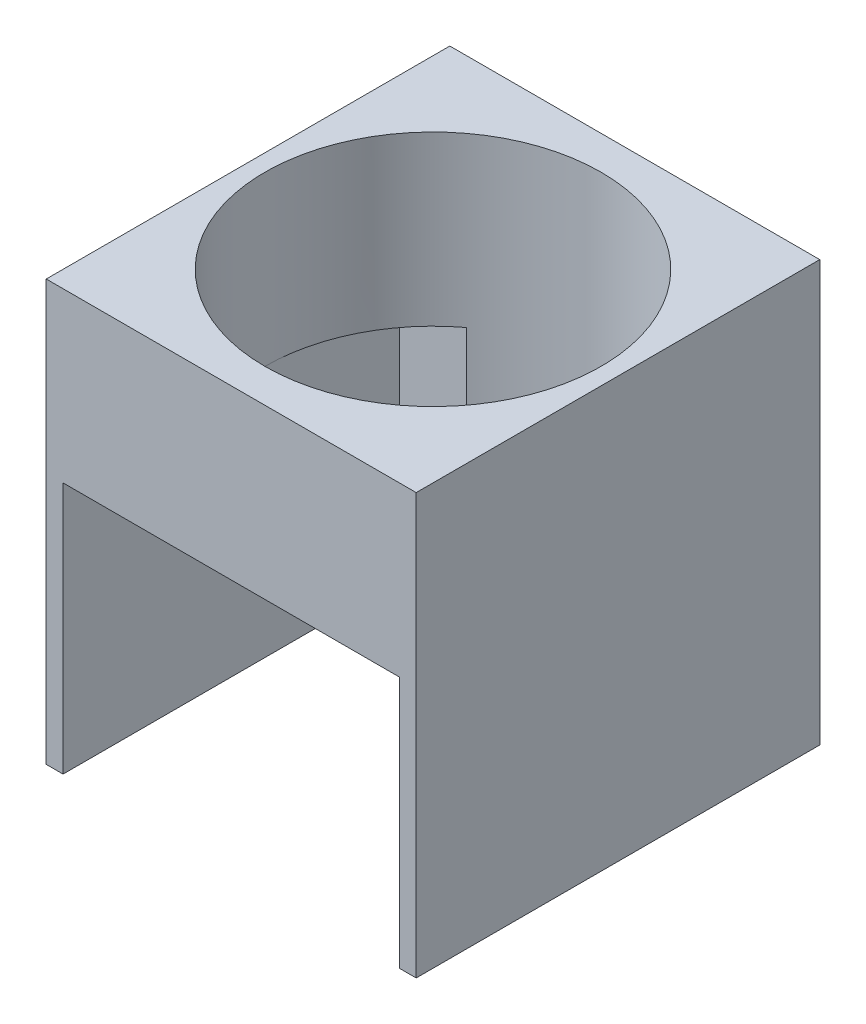
ISO-10303-21;
HEADER;
FILE_DESCRIPTION(('STEP AP214'),'2;1');
FILE_NAME('part.step','',(''),(''),'','','');
FILE_SCHEMA(('AUTOMOTIVE_DESIGN { 1 0 10303 214 1 1 1 1 }'));
ENDSEC;
DATA;
#1=APPLICATION_CONTEXT('core data for automotive mechanical design processes');
#2=APPLICATION_PROTOCOL_DEFINITION('international standard','automotive_design',2000,#1);
#3=PRODUCT_CONTEXT('',#1,'mechanical');
#4=PRODUCT('Part','Part','',(#3));
#5=PRODUCT_RELATED_PRODUCT_CATEGORY('part','',(#4));
#6=PRODUCT_DEFINITION_FORMATION('','',#4);
#7=PRODUCT_DEFINITION_CONTEXT('part definition',#1,'design');
#8=PRODUCT_DEFINITION('design','',#6,#7);
#9=PRODUCT_DEFINITION_SHAPE('','',#8);
#10=(LENGTH_UNIT() NAMED_UNIT(*) SI_UNIT(.MILLI.,.METRE.));
#11=(NAMED_UNIT(*) PLANE_ANGLE_UNIT() SI_UNIT($,.RADIAN.));
#12=(NAMED_UNIT(*) SI_UNIT($,.STERADIAN.) SOLID_ANGLE_UNIT());
#13=UNCERTAINTY_MEASURE_WITH_UNIT(LENGTH_MEASURE(1.E-05),#10,'distance_accuracy_value','');
#14=(GEOMETRIC_REPRESENTATION_CONTEXT(3) GLOBAL_UNCERTAINTY_ASSIGNED_CONTEXT((#13)) GLOBAL_UNIT_ASSIGNED_CONTEXT((#10,
#11,#12)) REPRESENTATION_CONTEXT('',''));
#15=CARTESIAN_POINT('',(0.,0.,0.));
#16=DIRECTION('',(0.,0.,1.));
#17=DIRECTION('',(1.,0.,0.));
#18=AXIS2_PLACEMENT_3D('',#15,#16,#17);
#19=CARTESIAN_POINT('',(0.,530.,0.));
#20=DIRECTION('',(0.,0.,-1.));
#21=DIRECTION('',(-1.,0.,0.));
#22=AXIS2_PLACEMENT_3D('',#19,#20,#21);
#23=PLANE('',#22);
#24=DIRECTION('',(0.,-1.,0.));
#25=VECTOR('',#24,1.);
#26=CARTESIAN_POINT('',(445.,530.,0.));
#27=LINE('',#26,#25);
#28=CARTESIAN_POINT('',(445.,530.,0.));
#29=VERTEX_POINT('',#28);
#30=CARTESIAN_POINT('',(445.,405.,0.));
#31=VERTEX_POINT('',#30);
#32=EDGE_CURVE('E156',#29,#31,#27,.T.);
#33=ORIENTED_EDGE('',*,*,#32,.T.);
#34=DIRECTION('',(1.,0.,0.));
#35=VECTOR('',#34,1.);
#36=CARTESIAN_POINT('',(0.,405.,0.));
#37=LINE('',#36,#35);
#38=CARTESIAN_POINT('',(450.,405.,0.));
#39=VERTEX_POINT('',#38);
#40=EDGE_CURVE('E122',#31,#39,#37,.T.);
#41=ORIENTED_EDGE('',*,*,#40,.T.);
#42=DIRECTION('',(0.,-1.,0.));
#43=VECTOR('',#42,1.);
#44=CARTESIAN_POINT('',(450.,280.,0.));
#45=LINE('',#44,#43);
#46=CARTESIAN_POINT('',(450.,480.,0.));
#47=VERTEX_POINT('',#46);
#48=EDGE_CURVE('E174',#47,#39,#45,.T.);
#49=ORIENTED_EDGE('',*,*,#48,.F.);
#50=DIRECTION('',(-1.,0.,0.));
#51=VECTOR('',#50,1.);
#52=CARTESIAN_POINT('',(450.,480.,0.));
#53=LINE('',#52,#51);
#54=CARTESIAN_POINT('',(550.,480.,0.));
#55=VERTEX_POINT('',#54);
#56=EDGE_CURVE('E187',#55,#47,#53,.T.);
#57=ORIENTED_EDGE('',*,*,#56,.F.);
#58=DIRECTION('',(0.,1.,0.));
#59=VECTOR('',#58,1.);
#60=CARTESIAN_POINT('',(550.,280.,0.));
#61=LINE('',#60,#59);
#62=CARTESIAN_POINT('',(550.,405.,0.));
#63=VERTEX_POINT('',#62);
#64=EDGE_CURVE('E184',#63,#55,#61,.T.);
#65=ORIENTED_EDGE('',*,*,#64,.F.);
#66=CARTESIAN_POINT('',(555.,405.,0.));
#67=VERTEX_POINT('',#66);
#68=EDGE_CURVE('E144',#63,#67,#37,.T.);
#69=ORIENTED_EDGE('',*,*,#68,.T.);
#70=DIRECTION('',(0.,1.,0.));
#71=VECTOR('',#70,1.);
#72=CARTESIAN_POINT('',(555.,530.,0.));
#73=LINE('',#72,#71);
#74=CARTESIAN_POINT('',(555.,530.,0.));
#75=VERTEX_POINT('',#74);
#76=EDGE_CURVE('E159',#67,#75,#73,.T.);
#77=ORIENTED_EDGE('',*,*,#76,.T.);
#78=DIRECTION('',(1.,0.,0.));
#79=VECTOR('',#78,1.);
#80=CARTESIAN_POINT('',(0.,530.,0.));
#81=LINE('',#80,#79);
#82=EDGE_CURVE('E198',#29,#75,#81,.T.);
#83=ORIENTED_EDGE('',*,*,#82,.F.);
#84=EDGE_LOOP('',(#33,#41,#49,#57,#65,#69,#77,#83));
#85=FACE_BOUND('',#84,.T.);
#86=ADVANCED_FACE('F38',(#85),#23,.F.);
#87=CARTESIAN_POINT('',(450.,480.,-100.));
#88=DIRECTION('',(0.,1.,0.));
#89=DIRECTION('',(-1.,0.,0.));
#90=AXIS2_PLACEMENT_3D('',#87,#88,#89);
#91=PLANE('',#90);
#92=DIRECTION('',(0.,0.,1.));
#93=VECTOR('',#92,1.);
#94=CARTESIAN_POINT('',(550.,480.,-100.));
#95=LINE('',#94,#93);
#96=CARTESIAN_POINT('',(550.,480.,-100.));
#97=VERTEX_POINT('',#96);
#98=CARTESIAN_POINT('',(550.,480.,-60.));
#99=VERTEX_POINT('',#98);
#100=EDGE_CURVE('E200',#97,#99,#95,.T.);
#101=ORIENTED_EDGE('',*,*,#100,.T.);
#102=CARTESIAN_POINT('',(500.,480.,-60.));
#103=DIRECTION('',(0.,1.,0.));
#104=DIRECTION('',(-1.,0.,0.));
#105=AXIS2_PLACEMENT_3D('',#102,#103,#104);
#106=CIRCLE('',#105,50.);
#107=CARTESIAN_POINT('',(530.,480.,-100.));
#108=VERTEX_POINT('',#107);
#109=EDGE_CURVE('E169',#99,#108,#106,.T.);
#110=ORIENTED_EDGE('',*,*,#109,.T.);
#111=DIRECTION('',(-1.,0.,0.));
#112=VECTOR('',#111,1.);
#113=CARTESIAN_POINT('',(450.,480.,-100.));
#114=LINE('',#113,#112);
#115=EDGE_CURVE('E175',#97,#108,#114,.T.);
#116=ORIENTED_EDGE('',*,*,#115,.F.);
#117=EDGE_LOOP('',(#101,#110,#116));
#118=FACE_BOUND('',#117,.T.);
#119=ADVANCED_FACE('F273',(#118),#91,.F.);
#120=DIRECTION('',(0.,0.,1.));
#121=VECTOR('',#120,1.);
#122=CARTESIAN_POINT('',(450.,480.,-100.));
#123=LINE('',#122,#121);
#124=CARTESIAN_POINT('',(450.,480.,-60.));
#125=VERTEX_POINT('',#124);
#126=EDGE_CURVE('E199',#125,#47,#123,.T.);
#127=ORIENTED_EDGE('',*,*,#126,.F.);
#128=EDGE_CURVE('E168',#125,#99,#106,.T.);
#129=ORIENTED_EDGE('',*,*,#128,.T.);
#130=EDGE_CURVE('E183',#99,#55,#95,.T.);
#131=ORIENTED_EDGE('',*,*,#130,.T.);
#132=ORIENTED_EDGE('',*,*,#56,.T.);
#133=EDGE_LOOP('',(#127,#129,#131,#132));
#134=FACE_BOUND('',#133,.T.);
#135=ADVANCED_FACE('F264',(#134),#91,.F.);
#136=CARTESIAN_POINT('',(0.,0.,-100.));
#137=DIRECTION('',(0.,0.,1.));
#138=DIRECTION('',(1.,0.,0.));
#139=AXIS2_PLACEMENT_3D('',#136,#137,#138);
#140=PLANE('',#139);
#141=DIRECTION('',(-1.,0.,0.));
#142=VECTOR('',#141,1.);
#143=CARTESIAN_POINT('',(0.,405.,-100.));
#144=LINE('',#143,#142);
#145=CARTESIAN_POINT('',(550.,405.,-100.));
#146=VERTEX_POINT('',#145);
#147=CARTESIAN_POINT('',(530.,405.,-100.));
#148=VERTEX_POINT('',#147);
#149=EDGE_CURVE('E236',#146,#148,#144,.T.);
#150=ORIENTED_EDGE('',*,*,#149,.F.);
#151=DIRECTION('',(0.,1.,0.));
#152=VECTOR('',#151,1.);
#153=CARTESIAN_POINT('',(550.,280.,-100.));
#154=LINE('',#153,#152);
#155=EDGE_CURVE('E170',#146,#97,#154,.T.);
#156=ORIENTED_EDGE('',*,*,#155,.T.);
#157=ORIENTED_EDGE('',*,*,#115,.T.);
#158=DIRECTION('',(0.,1.,0.));
#159=VECTOR('',#158,1.);
#160=CARTESIAN_POINT('',(530.,270.,-100.));
#161=LINE('',#160,#159);
#162=EDGE_CURVE('E11',#148,#108,#161,.T.);
#163=ORIENTED_EDGE('',*,*,#162,.F.);
#164=EDGE_LOOP('',(#150,#156,#157,#163));
#165=FACE_BOUND('',#164,.T.);
#166=ADVANCED_FACE('F276',(#165),#140,.T.);
#167=CARTESIAN_POINT('',(0.,530.,-120.));
#168=DIRECTION('',(0.,0.,1.));
#169=DIRECTION('',(1.,0.,0.));
#170=AXIS2_PLACEMENT_3D('',#167,#168,#169);
#171=PLANE('',#170);
#172=DIRECTION('',(0.,-1.,0.));
#173=VECTOR('',#172,1.);
#174=CARTESIAN_POINT('',(555.,280.,-120.));
#175=LINE('',#174,#173);
#176=CARTESIAN_POINT('',(555.,530.,-120.));
#177=VERTEX_POINT('',#176);
#178=CARTESIAN_POINT('',(555.,405.,-120.));
#179=VERTEX_POINT('',#178);
#180=EDGE_CURVE('E136',#177,#179,#175,.T.);
#181=ORIENTED_EDGE('',*,*,#180,.T.);
#182=DIRECTION('',(-1.,0.,0.));
#183=VECTOR('',#182,1.);
#184=CARTESIAN_POINT('',(445.,405.,-120.));
#185=LINE('',#184,#183);
#186=CARTESIAN_POINT('',(445.,405.,-120.));
#187=VERTEX_POINT('',#186);
#188=EDGE_CURVE('E53',#179,#187,#185,.T.);
#189=ORIENTED_EDGE('',*,*,#188,.T.);
#190=DIRECTION('',(0.,1.,0.));
#191=VECTOR('',#190,1.);
#192=CARTESIAN_POINT('',(445.,530.,-120.));
#193=LINE('',#192,#191);
#194=CARTESIAN_POINT('',(445.,530.,-120.));
#195=VERTEX_POINT('',#194);
#196=EDGE_CURVE('E134',#187,#195,#193,.T.);
#197=ORIENTED_EDGE('',*,*,#196,.T.);
#198=DIRECTION('',(-1.,0.,0.));
#199=VECTOR('',#198,1.);
#200=CARTESIAN_POINT('',(0.,530.,-120.));
#201=LINE('',#200,#199);
#202=EDGE_CURVE('E207',#177,#195,#201,.T.);
#203=ORIENTED_EDGE('',*,*,#202,.F.);
#204=EDGE_LOOP('',(#181,#189,#197,#203));
#205=FACE_BOUND('',#204,.T.);
#206=ADVANCED_FACE('F132',(#205),#171,.F.);
#207=CARTESIAN_POINT('',(0.,530.,0.));
#208=DIRECTION('',(0.,-1.,0.));
#209=DIRECTION('',(0.,0.,-1.));
#210=AXIS2_PLACEMENT_3D('',#207,#208,#209);
#211=PLANE('',#210);
#212=CARTESIAN_POINT('',(500.,530.,-60.));
#213=DIRECTION('',(0.,1.,0.));
#214=DIRECTION('',(0.,0.,1.));
#215=AXIS2_PLACEMENT_3D('',#212,#213,#214);
#216=CIRCLE('',#215,50.);
#217=CARTESIAN_POINT('',(500.,530.,-9.99999999999997));
#218=VERTEX_POINT('',#217);
#219=EDGE_CURVE('E162',#218,#218,#216,.T.);
#220=ORIENTED_EDGE('',*,*,#219,.F.);
#221=EDGE_LOOP('',(#220));
#222=FACE_BOUND('',#221,.T.);
#223=ORIENTED_EDGE('',*,*,#82,.T.);
#224=DIRECTION('',(0.,0.,1.));
#225=VECTOR('',#224,1.);
#226=CARTESIAN_POINT('',(555.,530.,-120.));
#227=LINE('',#226,#225);
#228=EDGE_CURVE('E153',#177,#75,#227,.T.);
#229=ORIENTED_EDGE('',*,*,#228,.F.);
#230=ORIENTED_EDGE('',*,*,#202,.T.);
#231=DIRECTION('',(0.,0.,1.));
#232=VECTOR('',#231,1.);
#233=CARTESIAN_POINT('',(445.,530.,-120.));
#234=LINE('',#233,#232);
#235=EDGE_CURVE('E141',#195,#29,#234,.T.);
#236=ORIENTED_EDGE('',*,*,#235,.T.);
#237=EDGE_LOOP('',(#223,#229,#230,#236));
#238=FACE_BOUND('',#237,.T.);
#239=ADVANCED_FACE('F257',(#222,#238),#211,.F.);
#240=CARTESIAN_POINT('',(450.,280.,-100.));
#241=DIRECTION('',(-1.,0.,0.));
#242=DIRECTION('',(0.,0.,1.));
#243=AXIS2_PLACEMENT_3D('',#240,#241,#242);
#244=PLANE('',#243);
#245=ORIENTED_EDGE('',*,*,#48,.T.);
#246=DIRECTION('',(0.,0.,-1.));
#247=VECTOR('',#246,1.);
#248=CARTESIAN_POINT('',(450.,405.,-100.));
#249=LINE('',#248,#247);
#250=CARTESIAN_POINT('',(450.,405.,-100.));
#251=VERTEX_POINT('',#250);
#252=EDGE_CURVE('E239',#39,#251,#249,.T.);
#253=ORIENTED_EDGE('',*,*,#252,.T.);
#254=DIRECTION('',(0.,-1.,0.));
#255=VECTOR('',#254,1.);
#256=CARTESIAN_POINT('',(450.,280.,-100.));
#257=LINE('',#256,#255);
#258=CARTESIAN_POINT('',(450.,480.,-100.));
#259=VERTEX_POINT('',#258);
#260=EDGE_CURVE('E179',#259,#251,#257,.T.);
#261=ORIENTED_EDGE('',*,*,#260,.F.);
#262=EDGE_CURVE('E194',#259,#125,#123,.T.);
#263=ORIENTED_EDGE('',*,*,#262,.T.);
#264=ORIENTED_EDGE('',*,*,#126,.T.);
#265=EDGE_LOOP('',(#245,#253,#261,#263,#264));
#266=FACE_BOUND('',#265,.T.);
#267=ADVANCED_FACE('F260',(#266),#244,.F.);
#268=CARTESIAN_POINT('',(470.,480.,-100.));
#269=VERTEX_POINT('',#268);
#270=EDGE_CURVE('E173',#269,#259,#114,.T.);
#271=ORIENTED_EDGE('',*,*,#270,.F.);
#272=EDGE_CURVE('E61',#269,#125,#106,.T.);
#273=ORIENTED_EDGE('',*,*,#272,.T.);
#274=ORIENTED_EDGE('',*,*,#262,.F.);
#275=EDGE_LOOP('',(#271,#273,#274));
#276=FACE_BOUND('',#275,.T.);
#277=ADVANCED_FACE('F220',(#276),#91,.F.);
#278=CARTESIAN_POINT('',(550.,280.,-100.));
#279=DIRECTION('',(1.,0.,0.));
#280=DIRECTION('',(0.,0.,-1.));
#281=AXIS2_PLACEMENT_3D('',#278,#279,#280);
#282=PLANE('',#281);
#283=ORIENTED_EDGE('',*,*,#155,.F.);
#284=DIRECTION('',(0.,0.,1.));
#285=VECTOR('',#284,1.);
#286=CARTESIAN_POINT('',(550.,405.,-100.));
#287=LINE('',#286,#285);
#288=EDGE_CURVE('E150',#146,#63,#287,.T.);
#289=ORIENTED_EDGE('',*,*,#288,.T.);
#290=ORIENTED_EDGE('',*,*,#64,.T.);
#291=ORIENTED_EDGE('',*,*,#130,.F.);
#292=ORIENTED_EDGE('',*,*,#100,.F.);
#293=EDGE_LOOP('',(#283,#289,#290,#291,#292));
#294=FACE_BOUND('',#293,.T.);
#295=ADVANCED_FACE('F270',(#294),#282,.F.);
#296=DIRECTION('',(-1.,0.,0.));
#297=VECTOR('',#296,1.);
#298=CARTESIAN_POINT('',(0.,405.,-100.));
#299=LINE('',#298,#297);
#300=CARTESIAN_POINT('',(470.,405.,-99.9999999999999));
#301=VERTEX_POINT('',#300);
#302=EDGE_CURVE('E218',#301,#251,#299,.T.);
#303=ORIENTED_EDGE('',*,*,#302,.F.);
#304=DIRECTION('',(0.,1.,0.));
#305=VECTOR('',#304,1.);
#306=CARTESIAN_POINT('',(470.,270.,-100.));
#307=LINE('',#306,#305);
#308=EDGE_CURVE('E46',#269,#301,#307,.F.);
#309=ORIENTED_EDGE('',*,*,#308,.F.);
#310=ORIENTED_EDGE('',*,*,#270,.T.);
#311=ORIENTED_EDGE('',*,*,#260,.T.);
#312=EDGE_LOOP('',(#303,#309,#310,#311));
#313=FACE_BOUND('',#312,.T.);
#314=ADVANCED_FACE('F216',(#313),#140,.T.);
#315=CARTESIAN_POINT('',(500.,270.,-60.));
#316=DIRECTION('',(0.,1.,0.));
#317=DIRECTION('',(0.,0.,1.));
#318=AXIS2_PLACEMENT_3D('',#315,#316,#317);
#319=CYLINDRICAL_SURFACE('',#318,50.);
#320=ORIENTED_EDGE('',*,*,#219,.T.);
#321=EDGE_LOOP('',(#320));
#322=FACE_BOUND('',#321,.T.);
#323=ORIENTED_EDGE('',*,*,#308,.T.);
#324=CARTESIAN_POINT('',(500.,405.,-60.));
#325=DIRECTION('',(0.,1.,0.));
#326=DIRECTION('',(0.,0.,1.));
#327=AXIS2_PLACEMENT_3D('',#324,#325,#326);
#328=CIRCLE('',#327,50.);
#329=EDGE_CURVE('E127',#301,#148,#328,.F.);
#330=ORIENTED_EDGE('',*,*,#329,.T.);
#331=ORIENTED_EDGE('',*,*,#162,.T.);
#332=ORIENTED_EDGE('',*,*,#109,.F.);
#333=ORIENTED_EDGE('',*,*,#128,.F.);
#334=ORIENTED_EDGE('',*,*,#272,.F.);
#335=EDGE_LOOP('',(#323,#330,#331,#332,#333,#334));
#336=FACE_BOUND('',#335,.T.);
#337=ADVANCED_FACE('F211',(#322,#336),#319,.F.);
#338=CARTESIAN_POINT('',(445.,530.,-120.));
#339=DIRECTION('',(1.,0.,0.));
#340=DIRECTION('',(0.,0.,-1.));
#341=AXIS2_PLACEMENT_3D('',#338,#339,#340);
#342=PLANE('',#341);
#343=ORIENTED_EDGE('',*,*,#196,.F.);
#344=DIRECTION('',(0.,0.,1.));
#345=VECTOR('',#344,1.);
#346=CARTESIAN_POINT('',(445.,405.,-120.));
#347=LINE('',#346,#345);
#348=EDGE_CURVE('E119',#187,#31,#347,.T.);
#349=ORIENTED_EDGE('',*,*,#348,.T.);
#350=ORIENTED_EDGE('',*,*,#32,.F.);
#351=ORIENTED_EDGE('',*,*,#235,.F.);
#352=EDGE_LOOP('',(#343,#349,#350,#351));
#353=FACE_BOUND('',#352,.T.);
#354=ADVANCED_FACE('F139',(#353),#342,.F.);
#355=CARTESIAN_POINT('',(555.,280.,-120.));
#356=DIRECTION('',(-1.,0.,0.));
#357=DIRECTION('',(0.,0.,1.));
#358=AXIS2_PLACEMENT_3D('',#355,#356,#357);
#359=PLANE('',#358);
#360=ORIENTED_EDGE('',*,*,#76,.F.);
#361=DIRECTION('',(0.,0.,1.));
#362=VECTOR('',#361,1.);
#363=CARTESIAN_POINT('',(555.,405.,-120.));
#364=LINE('',#363,#362);
#365=EDGE_CURVE('E128',#179,#67,#364,.T.);
#366=ORIENTED_EDGE('',*,*,#365,.F.);
#367=ORIENTED_EDGE('',*,*,#180,.F.);
#368=ORIENTED_EDGE('',*,*,#228,.T.);
#369=EDGE_LOOP('',(#360,#366,#367,#368));
#370=FACE_BOUND('',#369,.T.);
#371=ADVANCED_FACE('F254',(#370),#359,.F.);
#372=CARTESIAN_POINT('',(445.,405.,-120.));
#373=DIRECTION('',(0.,1.,0.));
#374=DIRECTION('',(0.,0.,1.));
#375=AXIS2_PLACEMENT_3D('',#372,#373,#374);
#376=PLANE('',#375);
#377=ORIENTED_EDGE('',*,*,#288,.F.);
#378=ORIENTED_EDGE('',*,*,#149,.T.);
#379=ORIENTED_EDGE('',*,*,#329,.F.);
#380=ORIENTED_EDGE('',*,*,#302,.T.);
#381=ORIENTED_EDGE('',*,*,#252,.F.);
#382=ORIENTED_EDGE('',*,*,#40,.F.);
#383=ORIENTED_EDGE('',*,*,#348,.F.);
#384=ORIENTED_EDGE('',*,*,#188,.F.);
#385=ORIENTED_EDGE('',*,*,#365,.T.);
#386=ORIENTED_EDGE('',*,*,#68,.F.);
#387=EDGE_LOOP('',(#377,#378,#379,#380,#381,#382,#383,#384,#385,#386));
#388=FACE_BOUND('',#387,.T.);
#389=ADVANCED_FACE('F120',(#388),#376,.F.);
#390=CLOSED_SHELL('',(#86,#119,#135,#166,#206,#239,#267,#277,#295,#314,#337,#354,#371,#389));
#391=MANIFOLD_SOLID_BREP('B2',#390);
#392=ADVANCED_BREP_SHAPE_REPRESENTATION('',(#18,#391),#14);
#393=SHAPE_DEFINITION_REPRESENTATION(#9,#392);
ENDSEC;
END-ISO-10303-21;
